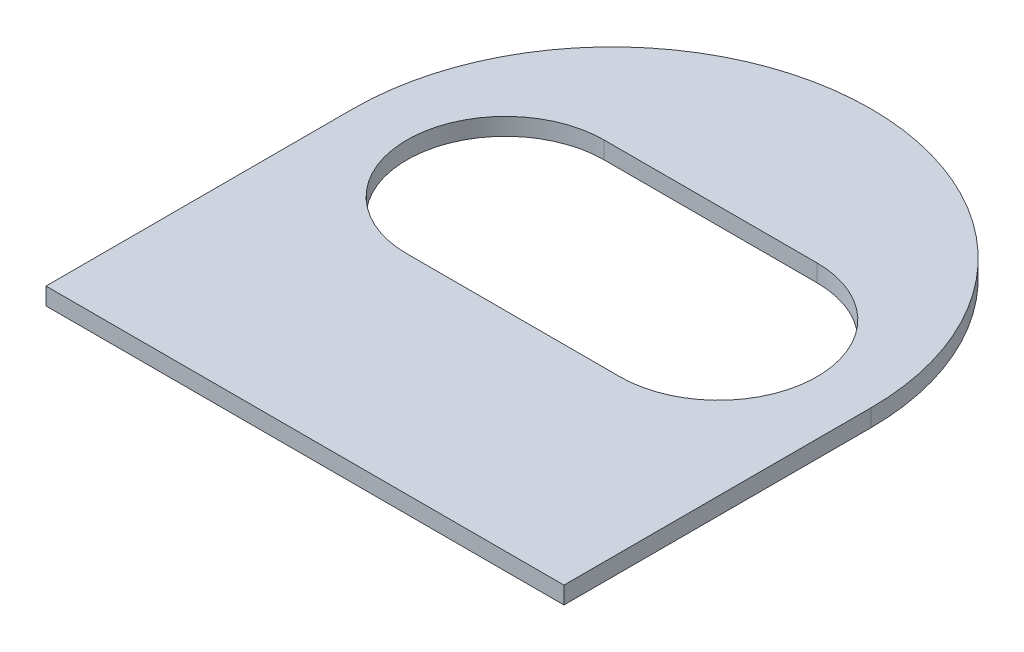
ISO-10303-21;
HEADER;
FILE_DESCRIPTION(('STEP AP214'),'2;1');
FILE_NAME('part.step','',(''),(''),'','','');
FILE_SCHEMA(('AUTOMOTIVE_DESIGN { 1 0 10303 214 1 1 1 1 }'));
ENDSEC;
DATA;
#1=APPLICATION_CONTEXT('core data for automotive mechanical design processes');
#2=APPLICATION_PROTOCOL_DEFINITION('international standard','automotive_design',2000,#1);
#3=PRODUCT_CONTEXT('',#1,'mechanical');
#4=PRODUCT('Part','Part','',(#3));
#5=PRODUCT_RELATED_PRODUCT_CATEGORY('part','',(#4));
#6=PRODUCT_DEFINITION_FORMATION('','',#4);
#7=PRODUCT_DEFINITION_CONTEXT('part definition',#1,'design');
#8=PRODUCT_DEFINITION('design','',#6,#7);
#9=PRODUCT_DEFINITION_SHAPE('','',#8);
#10=(LENGTH_UNIT() NAMED_UNIT(*) SI_UNIT(.MILLI.,.METRE.));
#11=(NAMED_UNIT(*) PLANE_ANGLE_UNIT() SI_UNIT($,.RADIAN.));
#12=(NAMED_UNIT(*) SI_UNIT($,.STERADIAN.) SOLID_ANGLE_UNIT());
#13=UNCERTAINTY_MEASURE_WITH_UNIT(LENGTH_MEASURE(1.E-05),#10,'distance_accuracy_value','');
#14=(GEOMETRIC_REPRESENTATION_CONTEXT(3) GLOBAL_UNCERTAINTY_ASSIGNED_CONTEXT((#13)) GLOBAL_UNIT_ASSIGNED_CONTEXT((#10,
#11,#12)) REPRESENTATION_CONTEXT('',''));
#15=CARTESIAN_POINT('',(0.,0.,0.));
#16=DIRECTION('',(0.,0.,1.));
#17=DIRECTION('',(1.,0.,0.));
#18=AXIS2_PLACEMENT_3D('',#15,#16,#17);
#19=CARTESIAN_POINT('',(0.,2.,0.));
#20=DIRECTION('',(0.,1.,0.));
#21=DIRECTION('',(0.,0.,1.));
#22=AXIS2_PLACEMENT_3D('',#19,#20,#21);
#23=PLANE('',#22);
#24=CARTESIAN_POINT('',(0.,2.,0.));
#25=DIRECTION('',(0.,1.,0.));
#26=DIRECTION('',(0.,0.,1.));
#27=AXIS2_PLACEMENT_3D('',#24,#25,#26);
#28=CIRCLE('',#27,30.);
#29=CARTESIAN_POINT('',(30.,2.,0.));
#30=VERTEX_POINT('',#29);
#31=CARTESIAN_POINT('',(-30.,2.,0.));
#32=VERTEX_POINT('',#31);
#33=EDGE_CURVE('E134',#30,#32,#28,.T.);
#34=ORIENTED_EDGE('',*,*,#33,.T.);
#35=DIRECTION('',(0.,0.,1.));
#36=VECTOR('',#35,1.);
#37=CARTESIAN_POINT('',(-30.,2.,0.));
#38=LINE('',#37,#36);
#39=CARTESIAN_POINT('',(-30.,2.,35.56));
#40=VERTEX_POINT('',#39);
#41=EDGE_CURVE('E137',#32,#40,#38,.T.);
#42=ORIENTED_EDGE('',*,*,#41,.T.);
#43=DIRECTION('',(1.,0.,0.));
#44=VECTOR('',#43,1.);
#45=CARTESIAN_POINT('',(-30.,2.,35.56));
#46=LINE('',#45,#44);
#47=CARTESIAN_POINT('',(30.,2.,35.56));
#48=VERTEX_POINT('',#47);
#49=EDGE_CURVE('E140',#40,#48,#46,.T.);
#50=ORIENTED_EDGE('',*,*,#49,.T.);
#51=DIRECTION('',(0.,0.,-1.));
#52=VECTOR('',#51,1.);
#53=CARTESIAN_POINT('',(30.,2.,0.));
#54=LINE('',#53,#52);
#55=EDGE_CURVE('E142',#48,#30,#54,.T.);
#56=ORIENTED_EDGE('',*,*,#55,.T.);
#57=EDGE_LOOP('',(#34,#42,#50,#56));
#58=FACE_BOUND('',#57,.T.);
#59=DIRECTION('',(-1.,0.,0.));
#60=VECTOR('',#59,1.);
#61=CARTESIAN_POINT('',(12.336270574153,2.,-11.4189534127294));
#62=LINE('',#61,#60);
#63=CARTESIAN_POINT('',(12.336270574153,2.,-11.4189534127294));
#64=VERTEX_POINT('',#63);
#65=CARTESIAN_POINT('',(-12.336270574153,2.,-11.4189534127294));
#66=VERTEX_POINT('',#65);
#67=EDGE_CURVE('E106',#64,#66,#62,.T.);
#68=ORIENTED_EDGE('',*,*,#67,.F.);
#69=CARTESIAN_POINT('',(12.336270574153,2.,0.));
#70=DIRECTION('',(0.,1.,0.));
#71=DIRECTION('',(0.,0.,1.));
#72=AXIS2_PLACEMENT_3D('',#69,#70,#71);
#73=CIRCLE('',#72,11.4189534127294);
#74=CARTESIAN_POINT('',(12.336270574153,2.,11.4189534127294));
#75=VERTEX_POINT('',#74);
#76=EDGE_CURVE('E98',#75,#64,#73,.T.);
#77=ORIENTED_EDGE('',*,*,#76,.F.);
#78=DIRECTION('',(1.,0.,0.));
#79=VECTOR('',#78,1.);
#80=CARTESIAN_POINT('',(12.336270574153,2.,11.4189534127294));
#81=LINE('',#80,#79);
#82=CARTESIAN_POINT('',(-12.336270574153,2.,11.4189534127294));
#83=VERTEX_POINT('',#82);
#84=EDGE_CURVE('E120',#83,#75,#81,.T.);
#85=ORIENTED_EDGE('',*,*,#84,.F.);
#86=CARTESIAN_POINT('',(-12.336270574153,2.,0.));
#87=DIRECTION('',(0.,1.,0.));
#88=DIRECTION('',(0.,0.,1.));
#89=AXIS2_PLACEMENT_3D('',#86,#87,#88);
#90=CIRCLE('',#89,11.4189534127294);
#91=EDGE_CURVE('E118',#66,#83,#90,.T.);
#92=ORIENTED_EDGE('',*,*,#91,.F.);
#93=EDGE_LOOP('',(#68,#77,#85,#92));
#94=FACE_BOUND('',#93,.T.);
#95=ADVANCED_FACE('F33',(#58,#94),#23,.T.);
#96=CARTESIAN_POINT('',(0.,0.,0.));
#97=DIRECTION('',(0.,1.,0.));
#98=DIRECTION('',(0.,0.,1.));
#99=AXIS2_PLACEMENT_3D('',#96,#97,#98);
#100=PLANE('',#99);
#101=CARTESIAN_POINT('',(0.,0.,0.));
#102=DIRECTION('',(0.,1.,0.));
#103=DIRECTION('',(0.,0.,1.));
#104=AXIS2_PLACEMENT_3D('',#101,#102,#103);
#105=CIRCLE('',#104,30.);
#106=CARTESIAN_POINT('',(30.,0.,0.));
#107=VERTEX_POINT('',#106);
#108=CARTESIAN_POINT('',(-30.,0.,0.));
#109=VERTEX_POINT('',#108);
#110=EDGE_CURVE('E114',#107,#109,#105,.T.);
#111=ORIENTED_EDGE('',*,*,#110,.F.);
#112=DIRECTION('',(0.,0.,-1.));
#113=VECTOR('',#112,1.);
#114=CARTESIAN_POINT('',(30.,0.,0.));
#115=LINE('',#114,#113);
#116=CARTESIAN_POINT('',(30.,0.,35.56));
#117=VERTEX_POINT('',#116);
#118=EDGE_CURVE('E138',#117,#107,#115,.T.);
#119=ORIENTED_EDGE('',*,*,#118,.F.);
#120=DIRECTION('',(1.,0.,0.));
#121=VECTOR('',#120,1.);
#122=CARTESIAN_POINT('',(-30.,0.,35.56));
#123=LINE('',#122,#121);
#124=CARTESIAN_POINT('',(-30.,0.,35.56));
#125=VERTEX_POINT('',#124);
#126=EDGE_CURVE('E149',#125,#117,#123,.T.);
#127=ORIENTED_EDGE('',*,*,#126,.F.);
#128=DIRECTION('',(0.,0.,1.));
#129=VECTOR('',#128,1.);
#130=CARTESIAN_POINT('',(-30.,0.,0.));
#131=LINE('',#130,#129);
#132=EDGE_CURVE('E147',#109,#125,#131,.T.);
#133=ORIENTED_EDGE('',*,*,#132,.F.);
#134=EDGE_LOOP('',(#111,#119,#127,#133));
#135=FACE_BOUND('',#134,.T.);
#136=CARTESIAN_POINT('',(12.336270574153,0.,0.));
#137=DIRECTION('',(0.,1.,0.));
#138=DIRECTION('',(0.,0.,1.));
#139=AXIS2_PLACEMENT_3D('',#136,#137,#138);
#140=CIRCLE('',#139,11.4189534127294);
#141=CARTESIAN_POINT('',(12.336270574153,0.,11.4189534127294));
#142=VERTEX_POINT('',#141);
#143=CARTESIAN_POINT('',(12.336270574153,0.,-11.4189534127294));
#144=VERTEX_POINT('',#143);
#145=EDGE_CURVE('E56',#142,#144,#140,.T.);
#146=ORIENTED_EDGE('',*,*,#145,.T.);
#147=DIRECTION('',(-1.,0.,0.));
#148=VECTOR('',#147,1.);
#149=CARTESIAN_POINT('',(12.336270574153,0.,-11.4189534127294));
#150=LINE('',#149,#148);
#151=CARTESIAN_POINT('',(-12.336270574153,0.,-11.4189534127294));
#152=VERTEX_POINT('',#151);
#153=EDGE_CURVE('E113',#144,#152,#150,.T.);
#154=ORIENTED_EDGE('',*,*,#153,.T.);
#155=CARTESIAN_POINT('',(-12.336270574153,0.,0.));
#156=DIRECTION('',(0.,1.,0.));
#157=DIRECTION('',(0.,0.,1.));
#158=AXIS2_PLACEMENT_3D('',#155,#156,#157);
#159=CIRCLE('',#158,11.4189534127294);
#160=CARTESIAN_POINT('',(-12.336270574153,0.,11.4189534127294));
#161=VERTEX_POINT('',#160);
#162=EDGE_CURVE('E126',#152,#161,#159,.T.);
#163=ORIENTED_EDGE('',*,*,#162,.T.);
#164=DIRECTION('',(1.,0.,0.));
#165=VECTOR('',#164,1.);
#166=CARTESIAN_POINT('',(12.336270574153,0.,11.4189534127294));
#167=LINE('',#166,#165);
#168=EDGE_CURVE('E107',#161,#142,#167,.T.);
#169=ORIENTED_EDGE('',*,*,#168,.T.);
#170=EDGE_LOOP('',(#146,#154,#163,#169));
#171=FACE_BOUND('',#170,.T.);
#172=ADVANCED_FACE('F167',(#135,#171),#100,.F.);
#173=CARTESIAN_POINT('',(0.,2.,0.));
#174=DIRECTION('',(0.,-1.,0.));
#175=DIRECTION('',(0.,0.,-1.));
#176=AXIS2_PLACEMENT_3D('',#173,#174,#175);
#177=CYLINDRICAL_SURFACE('',#176,30.);
#178=ORIENTED_EDGE('',*,*,#110,.T.);
#179=DIRECTION('',(0.,-1.,0.));
#180=VECTOR('',#179,1.);
#181=CARTESIAN_POINT('',(-30.,2.,0.));
#182=LINE('',#181,#180);
#183=EDGE_CURVE('E11',#32,#109,#182,.T.);
#184=ORIENTED_EDGE('',*,*,#183,.F.);
#185=ORIENTED_EDGE('',*,*,#33,.F.);
#186=DIRECTION('',(0.,-1.,0.));
#187=VECTOR('',#186,1.);
#188=CARTESIAN_POINT('',(30.,2.,0.));
#189=LINE('',#188,#187);
#190=EDGE_CURVE('E144',#30,#107,#189,.T.);
#191=ORIENTED_EDGE('',*,*,#190,.T.);
#192=EDGE_LOOP('',(#178,#184,#185,#191));
#193=FACE_BOUND('',#192,.T.);
#194=ADVANCED_FACE('F35',(#193),#177,.T.);
#195=CARTESIAN_POINT('',(-30.,2.,0.));
#196=DIRECTION('',(1.,0.,0.));
#197=DIRECTION('',(0.,0.,-1.));
#198=AXIS2_PLACEMENT_3D('',#195,#196,#197);
#199=PLANE('',#198);
#200=ORIENTED_EDGE('',*,*,#132,.T.);
#201=DIRECTION('',(0.,-1.,0.));
#202=VECTOR('',#201,1.);
#203=CARTESIAN_POINT('',(-30.,2.,35.56));
#204=LINE('',#203,#202);
#205=EDGE_CURVE('E41',#40,#125,#204,.T.);
#206=ORIENTED_EDGE('',*,*,#205,.F.);
#207=ORIENTED_EDGE('',*,*,#41,.F.);
#208=ORIENTED_EDGE('',*,*,#183,.T.);
#209=EDGE_LOOP('',(#200,#206,#207,#208));
#210=FACE_BOUND('',#209,.T.);
#211=ADVANCED_FACE('F177',(#210),#199,.F.);
#212=CARTESIAN_POINT('',(-30.,2.,35.56));
#213=DIRECTION('',(0.,0.,-1.));
#214=DIRECTION('',(-1.,0.,0.));
#215=AXIS2_PLACEMENT_3D('',#212,#213,#214);
#216=PLANE('',#215);
#217=ORIENTED_EDGE('',*,*,#126,.T.);
#218=DIRECTION('',(0.,-1.,0.));
#219=VECTOR('',#218,1.);
#220=CARTESIAN_POINT('',(30.,2.,35.56));
#221=LINE('',#220,#219);
#222=EDGE_CURVE('E154',#48,#117,#221,.T.);
#223=ORIENTED_EDGE('',*,*,#222,.F.);
#224=ORIENTED_EDGE('',*,*,#49,.F.);
#225=ORIENTED_EDGE('',*,*,#205,.T.);
#226=EDGE_LOOP('',(#217,#223,#224,#225));
#227=FACE_BOUND('',#226,.T.);
#228=ADVANCED_FACE('F161',(#227),#216,.F.);
#229=CARTESIAN_POINT('',(30.,2.,0.));
#230=DIRECTION('',(-1.,0.,0.));
#231=DIRECTION('',(0.,0.,1.));
#232=AXIS2_PLACEMENT_3D('',#229,#230,#231);
#233=PLANE('',#232);
#234=ORIENTED_EDGE('',*,*,#118,.T.);
#235=ORIENTED_EDGE('',*,*,#190,.F.);
#236=ORIENTED_EDGE('',*,*,#55,.F.);
#237=ORIENTED_EDGE('',*,*,#222,.T.);
#238=EDGE_LOOP('',(#234,#235,#236,#237));
#239=FACE_BOUND('',#238,.T.);
#240=ADVANCED_FACE('F171',(#239),#233,.F.);
#241=CARTESIAN_POINT('',(12.336270574153,2.,0.));
#242=DIRECTION('',(0.,-1.,0.));
#243=DIRECTION('',(0.,0.,-1.));
#244=AXIS2_PLACEMENT_3D('',#241,#242,#243);
#245=CYLINDRICAL_SURFACE('',#244,11.4189534127294);
#246=ORIENTED_EDGE('',*,*,#145,.F.);
#247=DIRECTION('',(0.,-1.,0.));
#248=VECTOR('',#247,1.);
#249=CARTESIAN_POINT('',(12.336270574153,2.,11.4189534127294));
#250=LINE('',#249,#248);
#251=EDGE_CURVE('E102',#75,#142,#250,.T.);
#252=ORIENTED_EDGE('',*,*,#251,.F.);
#253=ORIENTED_EDGE('',*,*,#76,.T.);
#254=DIRECTION('',(0.,-1.,0.));
#255=VECTOR('',#254,1.);
#256=CARTESIAN_POINT('',(12.336270574153,2.,-11.4189534127294));
#257=LINE('',#256,#255);
#258=EDGE_CURVE('E101',#64,#144,#257,.T.);
#259=ORIENTED_EDGE('',*,*,#258,.T.);
#260=EDGE_LOOP('',(#246,#252,#253,#259));
#261=FACE_BOUND('',#260,.T.);
#262=ADVANCED_FACE('F100',(#261),#245,.F.);
#263=CARTESIAN_POINT('',(12.336270574153,2.,-11.4189534127294));
#264=DIRECTION('',(0.,0.,1.));
#265=DIRECTION('',(1.,0.,0.));
#266=AXIS2_PLACEMENT_3D('',#263,#264,#265);
#267=PLANE('',#266);
#268=ORIENTED_EDGE('',*,*,#153,.F.);
#269=ORIENTED_EDGE('',*,*,#258,.F.);
#270=ORIENTED_EDGE('',*,*,#67,.T.);
#271=DIRECTION('',(0.,-1.,0.));
#272=VECTOR('',#271,1.);
#273=CARTESIAN_POINT('',(-12.336270574153,2.,-11.4189534127294));
#274=LINE('',#273,#272);
#275=EDGE_CURVE('E115',#66,#152,#274,.T.);
#276=ORIENTED_EDGE('',*,*,#275,.T.);
#277=EDGE_LOOP('',(#268,#269,#270,#276));
#278=FACE_BOUND('',#277,.T.);
#279=ADVANCED_FACE('F110',(#278),#267,.T.);
#280=CARTESIAN_POINT('',(-12.336270574153,2.,0.));
#281=DIRECTION('',(0.,-1.,0.));
#282=DIRECTION('',(0.,0.,-1.));
#283=AXIS2_PLACEMENT_3D('',#280,#281,#282);
#284=CYLINDRICAL_SURFACE('',#283,11.4189534127294);
#285=ORIENTED_EDGE('',*,*,#162,.F.);
#286=ORIENTED_EDGE('',*,*,#275,.F.);
#287=ORIENTED_EDGE('',*,*,#91,.T.);
#288=DIRECTION('',(0.,-1.,0.));
#289=VECTOR('',#288,1.);
#290=CARTESIAN_POINT('',(-12.336270574153,2.,11.4189534127294));
#291=LINE('',#290,#289);
#292=EDGE_CURVE('E48',#83,#161,#291,.T.);
#293=ORIENTED_EDGE('',*,*,#292,.T.);
#294=EDGE_LOOP('',(#285,#286,#287,#293));
#295=FACE_BOUND('',#294,.T.);
#296=ADVANCED_FACE('F200',(#295),#284,.F.);
#297=CARTESIAN_POINT('',(12.336270574153,2.,11.4189534127294));
#298=DIRECTION('',(0.,0.,-1.));
#299=DIRECTION('',(-1.,0.,0.));
#300=AXIS2_PLACEMENT_3D('',#297,#298,#299);
#301=PLANE('',#300);
#302=ORIENTED_EDGE('',*,*,#168,.F.);
#303=ORIENTED_EDGE('',*,*,#292,.F.);
#304=ORIENTED_EDGE('',*,*,#84,.T.);
#305=ORIENTED_EDGE('',*,*,#251,.T.);
#306=EDGE_LOOP('',(#302,#303,#304,#305));
#307=FACE_BOUND('',#306,.T.);
#308=ADVANCED_FACE('F204',(#307),#301,.T.);
#309=CLOSED_SHELL('',(#95,#172,#194,#211,#228,#240,#262,#279,#296,#308));
#310=MANIFOLD_SOLID_BREP('B2',#309);
#311=ADVANCED_BREP_SHAPE_REPRESENTATION('',(#18,#310),#14);
#312=SHAPE_DEFINITION_REPRESENTATION(#9,#311);
ENDSEC;
END-ISO-10303-21;
